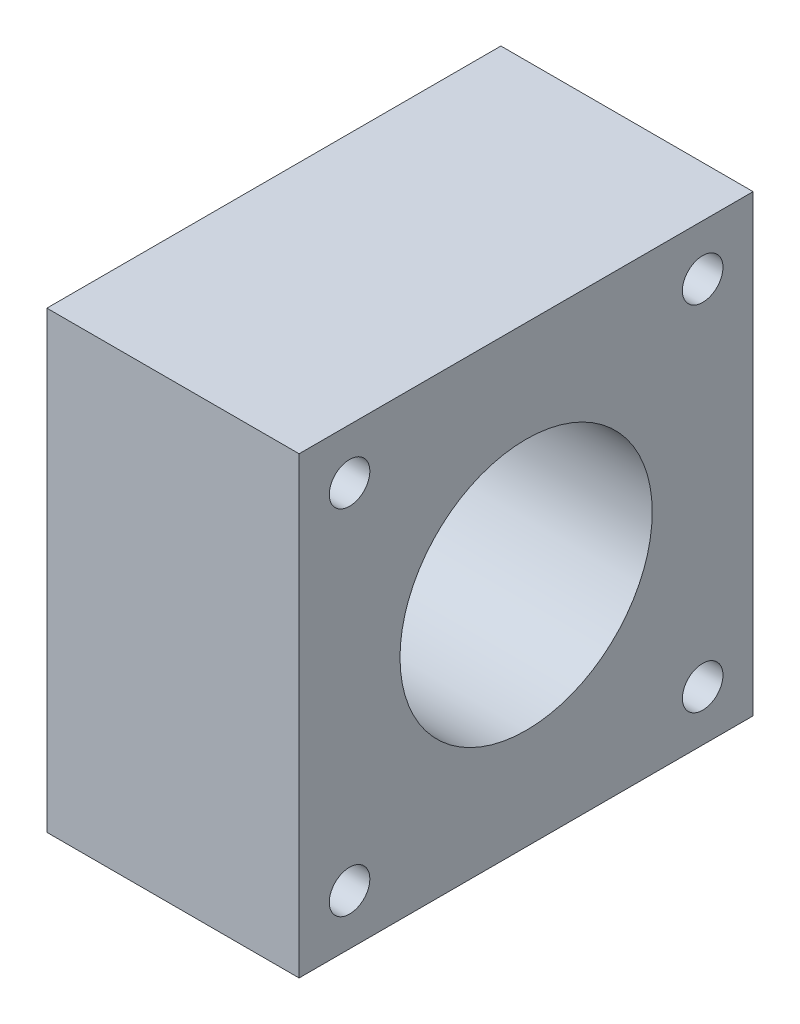
ISO-10303-21;
HEADER;
FILE_DESCRIPTION(('STEP AP214'),'2;1');
FILE_NAME('part.step','',(''),(''),'','','');
FILE_SCHEMA(('AUTOMOTIVE_DESIGN { 1 0 10303 214 1 1 1 1 }'));
ENDSEC;
DATA;
#1=APPLICATION_CONTEXT('core data for automotive mechanical design processes');
#2=APPLICATION_PROTOCOL_DEFINITION('international standard','automotive_design',2000,#1);
#3=PRODUCT_CONTEXT('',#1,'mechanical');
#4=PRODUCT('Part','Part','',(#3));
#5=PRODUCT_RELATED_PRODUCT_CATEGORY('part','',(#4));
#6=PRODUCT_DEFINITION_FORMATION('','',#4);
#7=PRODUCT_DEFINITION_CONTEXT('part definition',#1,'design');
#8=PRODUCT_DEFINITION('design','',#6,#7);
#9=PRODUCT_DEFINITION_SHAPE('','',#8);
#10=(LENGTH_UNIT() NAMED_UNIT(*) SI_UNIT(.MILLI.,.METRE.));
#11=(NAMED_UNIT(*) PLANE_ANGLE_UNIT() SI_UNIT($,.RADIAN.));
#12=(NAMED_UNIT(*) SI_UNIT($,.STERADIAN.) SOLID_ANGLE_UNIT());
#13=UNCERTAINTY_MEASURE_WITH_UNIT(LENGTH_MEASURE(1.E-05),#10,'distance_accuracy_value','');
#14=(GEOMETRIC_REPRESENTATION_CONTEXT(3) GLOBAL_UNCERTAINTY_ASSIGNED_CONTEXT((#13)) GLOBAL_UNIT_ASSIGNED_CONTEXT((#10,
#11,#12)) REPRESENTATION_CONTEXT('',''));
#15=CARTESIAN_POINT('',(0.,0.,0.));
#16=DIRECTION('',(0.,0.,1.));
#17=DIRECTION('',(1.,0.,0.));
#18=AXIS2_PLACEMENT_3D('',#15,#16,#17);
#19=CARTESIAN_POINT('',(0.,28.575,-28.575));
#20=DIRECTION('',(1.,0.,0.));
#21=DIRECTION('',(0.,0.,-1.));
#22=AXIS2_PLACEMENT_3D('',#19,#20,#21);
#23=CYLINDRICAL_SURFACE('',#22,15.875);
#24=CARTESIAN_POINT('',(31.75,28.575,-28.575));
#25=DIRECTION('',(1.,0.,0.));
#26=DIRECTION('',(0.,0.,-1.));
#27=AXIS2_PLACEMENT_3D('',#24,#25,#26);
#28=CIRCLE('',#27,15.875);
#29=CARTESIAN_POINT('',(31.75,28.575,-44.45));
#30=VERTEX_POINT('',#29);
#31=EDGE_CURVE('E160',#30,#30,#28,.T.);
#32=ORIENTED_EDGE('',*,*,#31,.T.);
#33=EDGE_LOOP('',(#32));
#34=FACE_BOUND('',#33,.T.);
#35=CARTESIAN_POINT('',(2.54,28.575,-28.575));
#36=DIRECTION('',(-1.,0.,0.));
#37=DIRECTION('',(0.,0.,1.));
#38=AXIS2_PLACEMENT_3D('',#35,#36,#37);
#39=CIRCLE('',#38,15.875);
#40=CARTESIAN_POINT('',(2.54,28.575,-12.7));
#41=VERTEX_POINT('',#40);
#42=EDGE_CURVE('E158',#41,#41,#39,.F.);
#43=ORIENTED_EDGE('',*,*,#42,.F.);
#44=EDGE_LOOP('',(#43));
#45=FACE_BOUND('',#44,.T.);
#46=ADVANCED_FACE('F37',(#34,#45),#23,.F.);
#47=CARTESIAN_POINT('',(31.75,0.,0.));
#48=DIRECTION('',(0.,0.,-1.));
#49=DIRECTION('',(-1.,0.,0.));
#50=AXIS2_PLACEMENT_3D('',#47,#48,#49);
#51=PLANE('',#50);
#52=DIRECTION('',(0.,-1.,0.));
#53=VECTOR('',#52,1.);
#54=CARTESIAN_POINT('',(0.,0.,0.));
#55=LINE('',#54,#53);
#56=CARTESIAN_POINT('',(0.,57.15,0.));
#57=VERTEX_POINT('',#56);
#58=CARTESIAN_POINT('',(0.,0.,0.));
#59=VERTEX_POINT('',#58);
#60=EDGE_CURVE('E149',#57,#59,#55,.T.);
#61=ORIENTED_EDGE('',*,*,#60,.T.);
#62=DIRECTION('',(-1.,0.,0.));
#63=VECTOR('',#62,1.);
#64=CARTESIAN_POINT('',(31.75,0.,0.));
#65=LINE('',#64,#63);
#66=CARTESIAN_POINT('',(31.75,0.,0.));
#67=VERTEX_POINT('',#66);
#68=EDGE_CURVE('E129',#67,#59,#65,.T.);
#69=ORIENTED_EDGE('',*,*,#68,.F.);
#70=DIRECTION('',(0.,-1.,0.));
#71=VECTOR('',#70,1.);
#72=CARTESIAN_POINT('',(31.75,0.,0.));
#73=LINE('',#72,#71);
#74=CARTESIAN_POINT('',(31.75,57.15,0.));
#75=VERTEX_POINT('',#74);
#76=EDGE_CURVE('E136',#75,#67,#73,.T.);
#77=ORIENTED_EDGE('',*,*,#76,.F.);
#78=DIRECTION('',(-1.,0.,0.));
#79=VECTOR('',#78,1.);
#80=CARTESIAN_POINT('',(31.75,57.15,0.));
#81=LINE('',#80,#79);
#82=EDGE_CURVE('E233',#75,#57,#81,.T.);
#83=ORIENTED_EDGE('',*,*,#82,.T.);
#84=EDGE_LOOP('',(#61,#69,#77,#83));
#85=FACE_BOUND('',#84,.T.);
#86=ADVANCED_FACE('F147',(#85),#51,.F.);
#87=CARTESIAN_POINT('',(31.75,0.,0.));
#88=DIRECTION('',(0.,1.,0.));
#89=DIRECTION('',(0.,0.,1.));
#90=AXIS2_PLACEMENT_3D('',#87,#88,#89);
#91=PLANE('',#90);
#92=DIRECTION('',(0.,0.,-1.));
#93=VECTOR('',#92,1.);
#94=CARTESIAN_POINT('',(0.,0.,0.));
#95=LINE('',#94,#93);
#96=CARTESIAN_POINT('',(0.,0.,-57.15));
#97=VERTEX_POINT('',#96);
#98=EDGE_CURVE('E235',#59,#97,#95,.T.);
#99=ORIENTED_EDGE('',*,*,#98,.T.);
#100=DIRECTION('',(-1.,0.,0.));
#101=VECTOR('',#100,1.);
#102=CARTESIAN_POINT('',(31.75,0.,-57.15));
#103=LINE('',#102,#101);
#104=CARTESIAN_POINT('',(31.75,0.,-57.15));
#105=VERTEX_POINT('',#104);
#106=EDGE_CURVE('E132',#105,#97,#103,.T.);
#107=ORIENTED_EDGE('',*,*,#106,.F.);
#108=DIRECTION('',(0.,0.,-1.));
#109=VECTOR('',#108,1.);
#110=CARTESIAN_POINT('',(31.75,0.,0.));
#111=LINE('',#110,#109);
#112=EDGE_CURVE('E125',#67,#105,#111,.T.);
#113=ORIENTED_EDGE('',*,*,#112,.F.);
#114=ORIENTED_EDGE('',*,*,#68,.T.);
#115=EDGE_LOOP('',(#99,#107,#113,#114));
#116=FACE_BOUND('',#115,.T.);
#117=ADVANCED_FACE('F127',(#116),#91,.F.);
#118=CARTESIAN_POINT('',(31.75,0.,-57.15));
#119=DIRECTION('',(0.,0.,1.));
#120=DIRECTION('',(1.,0.,0.));
#121=AXIS2_PLACEMENT_3D('',#118,#119,#120);
#122=PLANE('',#121);
#123=DIRECTION('',(0.,1.,0.));
#124=VECTOR('',#123,1.);
#125=CARTESIAN_POINT('',(0.,0.,-57.15));
#126=LINE('',#125,#124);
#127=CARTESIAN_POINT('',(0.,57.15,-57.15));
#128=VERTEX_POINT('',#127);
#129=EDGE_CURVE('E237',#97,#128,#126,.T.);
#130=ORIENTED_EDGE('',*,*,#129,.T.);
#131=DIRECTION('',(-1.,0.,0.));
#132=VECTOR('',#131,1.);
#133=CARTESIAN_POINT('',(31.75,57.15,-57.15));
#134=LINE('',#133,#132);
#135=CARTESIAN_POINT('',(31.75,57.15,-57.15));
#136=VERTEX_POINT('',#135);
#137=EDGE_CURVE('E154',#136,#128,#134,.T.);
#138=ORIENTED_EDGE('',*,*,#137,.F.);
#139=DIRECTION('',(0.,1.,0.));
#140=VECTOR('',#139,1.);
#141=CARTESIAN_POINT('',(31.75,0.,-57.15));
#142=LINE('',#141,#140);
#143=EDGE_CURVE('E135',#105,#136,#142,.T.);
#144=ORIENTED_EDGE('',*,*,#143,.F.);
#145=ORIENTED_EDGE('',*,*,#106,.T.);
#146=EDGE_LOOP('',(#130,#138,#144,#145));
#147=FACE_BOUND('',#146,.T.);
#148=ADVANCED_FACE('F247',(#147),#122,.F.);
#149=CARTESIAN_POINT('',(31.75,57.15,0.));
#150=DIRECTION('',(0.,-1.,0.));
#151=DIRECTION('',(0.,0.,-1.));
#152=AXIS2_PLACEMENT_3D('',#149,#150,#151);
#153=PLANE('',#152);
#154=DIRECTION('',(0.,0.,1.));
#155=VECTOR('',#154,1.);
#156=CARTESIAN_POINT('',(0.,57.15,0.));
#157=LINE('',#156,#155);
#158=EDGE_CURVE('E145',#128,#57,#157,.T.);
#159=ORIENTED_EDGE('',*,*,#158,.T.);
#160=ORIENTED_EDGE('',*,*,#82,.F.);
#161=DIRECTION('',(0.,0.,1.));
#162=VECTOR('',#161,1.);
#163=CARTESIAN_POINT('',(31.75,57.15,0.));
#164=LINE('',#163,#162);
#165=EDGE_CURVE('E141',#136,#75,#164,.T.);
#166=ORIENTED_EDGE('',*,*,#165,.F.);
#167=ORIENTED_EDGE('',*,*,#137,.T.);
#168=EDGE_LOOP('',(#159,#160,#166,#167));
#169=FACE_BOUND('',#168,.T.);
#170=ADVANCED_FACE('F244',(#169),#153,.F.);
#171=CARTESIAN_POINT('',(31.75,0.,0.));
#172=DIRECTION('',(-1.,0.,0.));
#173=DIRECTION('',(0.,0.,1.));
#174=AXIS2_PLACEMENT_3D('',#171,#172,#173);
#175=PLANE('',#174);
#176=CARTESIAN_POINT('',(31.75,50.8,-6.34999999999999));
#177=DIRECTION('',(1.,0.,0.));
#178=DIRECTION('',(0.,0.,-1.));
#179=AXIS2_PLACEMENT_3D('',#176,#177,#178);
#180=CIRCLE('',#179,2.55269999999999);
#181=CARTESIAN_POINT('',(31.75,50.8,-8.90269999999999));
#182=VERTEX_POINT('',#181);
#183=EDGE_CURVE('E356',#182,#182,#180,.T.);
#184=ORIENTED_EDGE('',*,*,#183,.F.);
#185=EDGE_LOOP('',(#184));
#186=FACE_BOUND('',#185,.T.);
#187=CARTESIAN_POINT('',(31.75,50.8,-50.8));
#188=DIRECTION('',(1.,0.,0.));
#189=DIRECTION('',(0.,0.,-1.));
#190=AXIS2_PLACEMENT_3D('',#187,#188,#189);
#191=CIRCLE('',#190,2.55269999999998);
#192=CARTESIAN_POINT('',(31.75,50.8,-53.3527));
#193=VERTEX_POINT('',#192);
#194=EDGE_CURVE('E358',#193,#193,#191,.T.);
#195=ORIENTED_EDGE('',*,*,#194,.F.);
#196=EDGE_LOOP('',(#195));
#197=FACE_BOUND('',#196,.T.);
#198=CARTESIAN_POINT('',(31.75,6.35000000000001,-50.8));
#199=DIRECTION('',(1.,0.,0.));
#200=DIRECTION('',(0.,0.,-1.));
#201=AXIS2_PLACEMENT_3D('',#198,#199,#200);
#202=CIRCLE('',#201,2.55269999999999);
#203=CARTESIAN_POINT('',(31.75,6.35000000000001,-53.3527));
#204=VERTEX_POINT('',#203);
#205=EDGE_CURVE('E364',#204,#204,#202,.T.);
#206=ORIENTED_EDGE('',*,*,#205,.F.);
#207=EDGE_LOOP('',(#206));
#208=FACE_BOUND('',#207,.T.);
#209=CARTESIAN_POINT('',(31.75,6.35000000000001,-6.35000000000002));
#210=DIRECTION('',(1.,0.,0.));
#211=DIRECTION('',(0.,0.,-1.));
#212=AXIS2_PLACEMENT_3D('',#209,#210,#211);
#213=CIRCLE('',#212,2.55269999999999);
#214=CARTESIAN_POINT('',(31.75,6.35000000000001,-8.90270000000001));
#215=VERTEX_POINT('',#214);
#216=EDGE_CURVE('E293',#215,#215,#213,.T.);
#217=ORIENTED_EDGE('',*,*,#216,.F.);
#218=EDGE_LOOP('',(#217));
#219=FACE_BOUND('',#218,.T.);
#220=ORIENTED_EDGE('',*,*,#31,.F.);
#221=EDGE_LOOP('',(#220));
#222=FACE_BOUND('',#221,.T.);
#223=ORIENTED_EDGE('',*,*,#76,.T.);
#224=ORIENTED_EDGE('',*,*,#112,.T.);
#225=ORIENTED_EDGE('',*,*,#143,.T.);
#226=ORIENTED_EDGE('',*,*,#165,.T.);
#227=EDGE_LOOP('',(#223,#224,#225,#226));
#228=FACE_BOUND('',#227,.T.);
#229=ADVANCED_FACE('F139',(#186,#197,#208,#219,#222,#228),#175,.F.);
#230=CARTESIAN_POINT('',(0.,0.,0.));
#231=DIRECTION('',(-1.,0.,0.));
#232=DIRECTION('',(0.,0.,1.));
#233=AXIS2_PLACEMENT_3D('',#230,#231,#232);
#234=PLANE('',#233);
#235=CARTESIAN_POINT('',(0.,50.8,-6.34999999999999));
#236=DIRECTION('',(1.,0.,0.));
#237=DIRECTION('',(0.,0.,-1.));
#238=AXIS2_PLACEMENT_3D('',#235,#236,#237);
#239=CIRCLE('',#238,2.55269999999999);
#240=CARTESIAN_POINT('',(0.,50.8,-8.90269999999999));
#241=VERTEX_POINT('',#240);
#242=EDGE_CURVE('E281',#241,#241,#239,.T.);
#243=ORIENTED_EDGE('',*,*,#242,.T.);
#244=EDGE_LOOP('',(#243));
#245=FACE_BOUND('',#244,.T.);
#246=CARTESIAN_POINT('',(0.,50.8,-50.8));
#247=DIRECTION('',(1.,0.,0.));
#248=DIRECTION('',(0.,0.,-1.));
#249=AXIS2_PLACEMENT_3D('',#246,#247,#248);
#250=CIRCLE('',#249,2.5527);
#251=CARTESIAN_POINT('',(0.,50.8,-53.3527));
#252=VERTEX_POINT('',#251);
#253=EDGE_CURVE('E285',#252,#252,#250,.T.);
#254=ORIENTED_EDGE('',*,*,#253,.T.);
#255=EDGE_LOOP('',(#254));
#256=FACE_BOUND('',#255,.T.);
#257=CARTESIAN_POINT('',(0.,6.35000000000001,-50.8));
#258=DIRECTION('',(1.,0.,0.));
#259=DIRECTION('',(0.,0.,-1.));
#260=AXIS2_PLACEMENT_3D('',#257,#258,#259);
#261=CIRCLE('',#260,2.55269999999999);
#262=CARTESIAN_POINT('',(0.,6.35000000000001,-53.3527));
#263=VERTEX_POINT('',#262);
#264=EDGE_CURVE('E289',#263,#263,#261,.T.);
#265=ORIENTED_EDGE('',*,*,#264,.T.);
#266=EDGE_LOOP('',(#265));
#267=FACE_BOUND('',#266,.T.);
#268=CARTESIAN_POINT('',(0.,6.35000000000001,-6.35000000000002));
#269=DIRECTION('',(1.,0.,0.));
#270=DIRECTION('',(0.,0.,-1.));
#271=AXIS2_PLACEMENT_3D('',#268,#269,#270);
#272=CIRCLE('',#271,2.55269999999999);
#273=CARTESIAN_POINT('',(0.,6.35000000000001,-8.90270000000001));
#274=VERTEX_POINT('',#273);
#275=EDGE_CURVE('E224',#274,#274,#272,.T.);
#276=ORIENTED_EDGE('',*,*,#275,.T.);
#277=EDGE_LOOP('',(#276));
#278=FACE_BOUND('',#277,.T.);
#279=CARTESIAN_POINT('',(0.,28.575,-28.575));
#280=DIRECTION('',(-1.,0.,0.));
#281=DIRECTION('',(0.,0.,1.));
#282=AXIS2_PLACEMENT_3D('',#279,#280,#281);
#283=CIRCLE('',#282,19.05);
#284=CARTESIAN_POINT('',(0.,45.72,-36.878702487445));
#285=VERTEX_POINT('',#284);
#286=CARTESIAN_POINT('',(0.,11.43,-36.8787024874449));
#287=VERTEX_POINT('',#286);
#288=EDGE_CURVE('E221',#285,#287,#283,.T.);
#289=ORIENTED_EDGE('',*,*,#288,.F.);
#290=CARTESIAN_POINT('',(0.,42.8625,-35.4947520728708));
#291=DIRECTION('',(-1.,0.,0.));
#292=DIRECTION('',(0.,0.,1.));
#293=AXIS2_PLACEMENT_3D('',#290,#291,#292);
#294=CIRCLE('',#293,3.175);
#295=CARTESIAN_POINT('',(0.,46.0375,-35.4947520728708));
#296=VERTEX_POINT('',#295);
#297=EDGE_CURVE('E11',#285,#296,#294,.F.);
#298=ORIENTED_EDGE('',*,*,#297,.T.);
#299=DIRECTION('',(0.,0.,-1.));
#300=VECTOR('',#299,1.);
#301=CARTESIAN_POINT('',(0.,46.0375,-36.1883825432589));
#302=LINE('',#301,#300);
#303=CARTESIAN_POINT('',(0.,46.0375,-21.6552479271292));
#304=VERTEX_POINT('',#303);
#305=EDGE_CURVE('E195',#304,#296,#302,.T.);
#306=ORIENTED_EDGE('',*,*,#305,.F.);
#307=CARTESIAN_POINT('',(0.,42.8625,-21.6552479271292));
#308=DIRECTION('',(-1.,0.,0.));
#309=DIRECTION('',(0.,0.,1.));
#310=AXIS2_PLACEMENT_3D('',#307,#308,#309);
#311=CIRCLE('',#310,3.175);
#312=CARTESIAN_POINT('',(0.,45.72,-20.2712975125551));
#313=VERTEX_POINT('',#312);
#314=EDGE_CURVE('E45',#304,#313,#311,.F.);
#315=ORIENTED_EDGE('',*,*,#314,.T.);
#316=CARTESIAN_POINT('',(0.,28.575,-28.575));
#317=DIRECTION('',(-1.,0.,0.));
#318=DIRECTION('',(0.,0.,-1.));
#319=AXIS2_PLACEMENT_3D('',#316,#317,#318);
#320=CIRCLE('',#319,19.05);
#321=CARTESIAN_POINT('',(0.,11.43,-20.2712975125551));
#322=VERTEX_POINT('',#321);
#323=EDGE_CURVE('E194',#322,#313,#320,.T.);
#324=ORIENTED_EDGE('',*,*,#323,.F.);
#325=CARTESIAN_POINT('',(0.,14.2875,-21.6552479271292));
#326=DIRECTION('',(-1.,0.,0.));
#327=DIRECTION('',(0.,0.,1.));
#328=AXIS2_PLACEMENT_3D('',#325,#326,#327);
#329=CIRCLE('',#328,3.175);
#330=CARTESIAN_POINT('',(0.,11.1125,-21.6552479271292));
#331=VERTEX_POINT('',#330);
#332=EDGE_CURVE('E189',#322,#331,#329,.F.);
#333=ORIENTED_EDGE('',*,*,#332,.T.);
#334=DIRECTION('',(0.,0.,1.));
#335=VECTOR('',#334,1.);
#336=CARTESIAN_POINT('',(0.,11.1125,-20.9616174567411));
#337=LINE('',#336,#335);
#338=CARTESIAN_POINT('',(0.,11.1125,-35.4947520728708));
#339=VERTEX_POINT('',#338);
#340=EDGE_CURVE('E201',#339,#331,#337,.T.);
#341=ORIENTED_EDGE('',*,*,#340,.F.);
#342=CARTESIAN_POINT('',(0.,14.2875,-35.4947520728708));
#343=DIRECTION('',(-1.,0.,0.));
#344=DIRECTION('',(0.,0.,1.));
#345=AXIS2_PLACEMENT_3D('',#342,#343,#344);
#346=CIRCLE('',#345,3.175);
#347=EDGE_CURVE('E187',#339,#287,#346,.F.);
#348=ORIENTED_EDGE('',*,*,#347,.T.);
#349=EDGE_LOOP('',(#289,#298,#306,#315,#324,#333,#341,#348));
#350=FACE_BOUND('',#349,.T.);
#351=ORIENTED_EDGE('',*,*,#60,.F.);
#352=ORIENTED_EDGE('',*,*,#158,.F.);
#353=ORIENTED_EDGE('',*,*,#129,.F.);
#354=ORIENTED_EDGE('',*,*,#98,.F.);
#355=EDGE_LOOP('',(#351,#352,#353,#354));
#356=FACE_BOUND('',#355,.T.);
#357=ADVANCED_FACE('F192',(#245,#256,#267,#278,#350,#356),#234,.T.);
#358=CARTESIAN_POINT('',(2.54,28.575,-28.575));
#359=DIRECTION('',(-1.,0.,0.));
#360=DIRECTION('',(0.,0.,1.));
#361=AXIS2_PLACEMENT_3D('',#358,#359,#360);
#362=PLANE('',#361);
#363=CARTESIAN_POINT('',(2.54,28.575,-28.575));
#364=DIRECTION('',(-1.,0.,0.));
#365=DIRECTION('',(0.,0.,1.));
#366=AXIS2_PLACEMENT_3D('',#363,#364,#365);
#367=CIRCLE('',#366,19.05);
#368=CARTESIAN_POINT('',(2.54,45.72,-36.878702487445));
#369=VERTEX_POINT('',#368);
#370=CARTESIAN_POINT('',(2.54,11.43,-36.8787024874449));
#371=VERTEX_POINT('',#370);
#372=EDGE_CURVE('E228',#369,#371,#367,.T.);
#373=ORIENTED_EDGE('',*,*,#372,.T.);
#374=CARTESIAN_POINT('',(2.54,14.2875,-35.4947520728708));
#375=DIRECTION('',(-1.,0.,0.));
#376=DIRECTION('',(0.,0.,1.));
#377=AXIS2_PLACEMENT_3D('',#374,#375,#376);
#378=CIRCLE('',#377,3.175);
#379=CARTESIAN_POINT('',(2.54,11.1125,-35.4947520728708));
#380=VERTEX_POINT('',#379);
#381=EDGE_CURVE('E176',#371,#380,#378,.T.);
#382=ORIENTED_EDGE('',*,*,#381,.T.);
#383=DIRECTION('',(0.,0.,1.));
#384=VECTOR('',#383,1.);
#385=CARTESIAN_POINT('',(2.54,11.1125,-20.9616174567411));
#386=LINE('',#385,#384);
#387=CARTESIAN_POINT('',(2.54,11.1125,-21.6552479271292));
#388=VERTEX_POINT('',#387);
#389=EDGE_CURVE('E217',#380,#388,#386,.T.);
#390=ORIENTED_EDGE('',*,*,#389,.T.);
#391=CARTESIAN_POINT('',(2.54,14.2875,-21.6552479271292));
#392=DIRECTION('',(-1.,0.,0.));
#393=DIRECTION('',(0.,0.,1.));
#394=AXIS2_PLACEMENT_3D('',#391,#392,#393);
#395=CIRCLE('',#394,3.175);
#396=CARTESIAN_POINT('',(2.54,11.43,-20.2712975125551));
#397=VERTEX_POINT('',#396);
#398=EDGE_CURVE('E174',#388,#397,#395,.T.);
#399=ORIENTED_EDGE('',*,*,#398,.T.);
#400=CARTESIAN_POINT('',(2.54,28.575,-28.575));
#401=DIRECTION('',(-1.,0.,0.));
#402=DIRECTION('',(0.,0.,-1.));
#403=AXIS2_PLACEMENT_3D('',#400,#401,#402);
#404=CIRCLE('',#403,19.05);
#405=CARTESIAN_POINT('',(2.54,45.72,-20.2712975125551));
#406=VERTEX_POINT('',#405);
#407=EDGE_CURVE('E212',#397,#406,#404,.T.);
#408=ORIENTED_EDGE('',*,*,#407,.T.);
#409=CARTESIAN_POINT('',(2.54,42.8625,-21.6552479271292));
#410=DIRECTION('',(-1.,0.,0.));
#411=DIRECTION('',(0.,0.,1.));
#412=AXIS2_PLACEMENT_3D('',#409,#410,#411);
#413=CIRCLE('',#412,3.175);
#414=CARTESIAN_POINT('',(2.54,46.0375,-21.6552479271292));
#415=VERTEX_POINT('',#414);
#416=EDGE_CURVE('E172',#406,#415,#413,.T.);
#417=ORIENTED_EDGE('',*,*,#416,.T.);
#418=DIRECTION('',(0.,0.,-1.));
#419=VECTOR('',#418,1.);
#420=CARTESIAN_POINT('',(2.54,46.0375,-36.1883825432589));
#421=LINE('',#420,#419);
#422=CARTESIAN_POINT('',(2.54,46.0375,-35.4947520728708));
#423=VERTEX_POINT('',#422);
#424=EDGE_CURVE('E161',#415,#423,#421,.T.);
#425=ORIENTED_EDGE('',*,*,#424,.T.);
#426=CARTESIAN_POINT('',(2.54,42.8625,-35.4947520728708));
#427=DIRECTION('',(-1.,0.,0.));
#428=DIRECTION('',(0.,0.,1.));
#429=AXIS2_PLACEMENT_3D('',#426,#427,#428);
#430=CIRCLE('',#429,3.175);
#431=EDGE_CURVE('E170',#423,#369,#430,.T.);
#432=ORIENTED_EDGE('',*,*,#431,.T.);
#433=EDGE_LOOP('',(#373,#382,#390,#399,#408,#417,#425,#432));
#434=FACE_BOUND('',#433,.T.);
#435=ORIENTED_EDGE('',*,*,#42,.T.);
#436=EDGE_LOOP('',(#435));
#437=FACE_BOUND('',#436,.T.);
#438=ADVANCED_FACE('F209',(#434,#437),#362,.T.);
#439=CARTESIAN_POINT('',(2.54,28.575,-28.575));
#440=DIRECTION('',(-1.,0.,0.));
#441=DIRECTION('',(0.,0.,1.));
#442=AXIS2_PLACEMENT_3D('',#439,#440,#441);
#443=CYLINDRICAL_SURFACE('',#442,19.05);
#444=ORIENTED_EDGE('',*,*,#288,.T.);
#445=DIRECTION('',(-1.,0.,0.));
#446=VECTOR('',#445,1.);
#447=CARTESIAN_POINT('',(2.54,11.43,-36.8787024874449));
#448=LINE('',#447,#446);
#449=EDGE_CURVE('E168',#287,#371,#448,.F.);
#450=ORIENTED_EDGE('',*,*,#449,.T.);
#451=ORIENTED_EDGE('',*,*,#372,.F.);
#452=DIRECTION('',(-1.,0.,0.));
#453=VECTOR('',#452,1.);
#454=CARTESIAN_POINT('',(2.54,45.72,-36.878702487445));
#455=LINE('',#454,#453);
#456=EDGE_CURVE('E165',#369,#285,#455,.T.);
#457=ORIENTED_EDGE('',*,*,#456,.T.);
#458=EDGE_LOOP('',(#444,#450,#451,#457));
#459=FACE_BOUND('',#458,.T.);
#460=ADVANCED_FACE('F268',(#459),#443,.F.);
#461=CARTESIAN_POINT('',(2.54,46.0375,-36.1883825432589));
#462=DIRECTION('',(0.,1.,0.));
#463=DIRECTION('',(0.,0.,1.));
#464=AXIS2_PLACEMENT_3D('',#461,#462,#463);
#465=PLANE('',#464);
#466=ORIENTED_EDGE('',*,*,#424,.F.);
#467=DIRECTION('',(1.,0.,0.));
#468=VECTOR('',#467,1.);
#469=CARTESIAN_POINT('',(0.,46.0375,-21.6552479271292));
#470=LINE('',#469,#468);
#471=EDGE_CURVE('E185',#415,#304,#470,.F.);
#472=ORIENTED_EDGE('',*,*,#471,.T.);
#473=ORIENTED_EDGE('',*,*,#305,.T.);
#474=DIRECTION('',(1.,0.,0.));
#475=VECTOR('',#474,1.);
#476=CARTESIAN_POINT('',(2.54,46.0375,-35.4947520728708));
#477=LINE('',#476,#475);
#478=EDGE_CURVE('E183',#296,#423,#477,.T.);
#479=ORIENTED_EDGE('',*,*,#478,.T.);
#480=EDGE_LOOP('',(#466,#472,#473,#479));
#481=FACE_BOUND('',#480,.T.);
#482=ADVANCED_FACE('F214',(#481),#465,.F.);
#483=CARTESIAN_POINT('',(2.54,28.575,-28.575));
#484=DIRECTION('',(-1.,0.,0.));
#485=DIRECTION('',(0.,0.,1.));
#486=AXIS2_PLACEMENT_3D('',#483,#484,#485);
#487=CYLINDRICAL_SURFACE('',#486,19.05);
#488=ORIENTED_EDGE('',*,*,#407,.F.);
#489=DIRECTION('',(-1.,0.,0.));
#490=VECTOR('',#489,1.);
#491=CARTESIAN_POINT('',(2.54,11.43,-20.2712975125551));
#492=LINE('',#491,#490);
#493=EDGE_CURVE('E180',#397,#322,#492,.T.);
#494=ORIENTED_EDGE('',*,*,#493,.T.);
#495=ORIENTED_EDGE('',*,*,#323,.T.);
#496=DIRECTION('',(-1.,0.,0.));
#497=VECTOR('',#496,1.);
#498=CARTESIAN_POINT('',(2.54,45.72,-20.2712975125551));
#499=LINE('',#498,#497);
#500=EDGE_CURVE('E178',#313,#406,#499,.F.);
#501=ORIENTED_EDGE('',*,*,#500,.T.);
#502=EDGE_LOOP('',(#488,#494,#495,#501));
#503=FACE_BOUND('',#502,.T.);
#504=ADVANCED_FACE('F198',(#503),#487,.F.);
#505=CARTESIAN_POINT('',(2.54,11.1125,-20.9616174567411));
#506=DIRECTION('',(0.,-1.,0.));
#507=DIRECTION('',(0.,0.,-1.));
#508=AXIS2_PLACEMENT_3D('',#505,#506,#507);
#509=PLANE('',#508);
#510=ORIENTED_EDGE('',*,*,#389,.F.);
#511=DIRECTION('',(1.,0.,0.));
#512=VECTOR('',#511,1.);
#513=CARTESIAN_POINT('',(0.,11.1125,-35.4947520728708));
#514=LINE('',#513,#512);
#515=EDGE_CURVE('E152',#380,#339,#514,.F.);
#516=ORIENTED_EDGE('',*,*,#515,.T.);
#517=ORIENTED_EDGE('',*,*,#340,.T.);
#518=DIRECTION('',(1.,0.,0.));
#519=VECTOR('',#518,1.);
#520=CARTESIAN_POINT('',(2.54,11.1125,-21.6552479271292));
#521=LINE('',#520,#519);
#522=EDGE_CURVE('E150',#331,#388,#521,.T.);
#523=ORIENTED_EDGE('',*,*,#522,.T.);
#524=EDGE_LOOP('',(#510,#516,#517,#523));
#525=FACE_BOUND('',#524,.T.);
#526=ADVANCED_FACE('F309',(#525),#509,.F.);
#527=CARTESIAN_POINT('',(2.54,14.2875,-35.4947520728708));
#528=DIRECTION('',(-1.,0.,0.));
#529=DIRECTION('',(0.,0.,1.));
#530=AXIS2_PLACEMENT_3D('',#527,#528,#529);
#531=CYLINDRICAL_SURFACE('',#530,3.175);
#532=ORIENTED_EDGE('',*,*,#381,.F.);
#533=ORIENTED_EDGE('',*,*,#449,.F.);
#534=ORIENTED_EDGE('',*,*,#347,.F.);
#535=ORIENTED_EDGE('',*,*,#515,.F.);
#536=EDGE_LOOP('',(#532,#533,#534,#535));
#537=FACE_BOUND('',#536,.T.);
#538=ADVANCED_FACE('F311',(#537),#531,.F.);
#539=CARTESIAN_POINT('',(2.54,14.2875,-21.6552479271292));
#540=DIRECTION('',(-1.,0.,0.));
#541=DIRECTION('',(0.,0.,1.));
#542=AXIS2_PLACEMENT_3D('',#539,#540,#541);
#543=CYLINDRICAL_SURFACE('',#542,3.175);
#544=ORIENTED_EDGE('',*,*,#398,.F.);
#545=ORIENTED_EDGE('',*,*,#522,.F.);
#546=ORIENTED_EDGE('',*,*,#332,.F.);
#547=ORIENTED_EDGE('',*,*,#493,.F.);
#548=EDGE_LOOP('',(#544,#545,#546,#547));
#549=FACE_BOUND('',#548,.T.);
#550=ADVANCED_FACE('F307',(#549),#543,.F.);
#551=CARTESIAN_POINT('',(2.54,42.8625,-21.6552479271292));
#552=DIRECTION('',(-1.,0.,0.));
#553=DIRECTION('',(0.,0.,1.));
#554=AXIS2_PLACEMENT_3D('',#551,#552,#553);
#555=CYLINDRICAL_SURFACE('',#554,3.175);
#556=ORIENTED_EDGE('',*,*,#416,.F.);
#557=ORIENTED_EDGE('',*,*,#500,.F.);
#558=ORIENTED_EDGE('',*,*,#314,.F.);
#559=ORIENTED_EDGE('',*,*,#471,.F.);
#560=EDGE_LOOP('',(#556,#557,#558,#559));
#561=FACE_BOUND('',#560,.T.);
#562=ADVANCED_FACE('F204',(#561),#555,.F.);
#563=CARTESIAN_POINT('',(2.54,42.8625,-35.4947520728708));
#564=DIRECTION('',(-1.,0.,0.));
#565=DIRECTION('',(0.,0.,1.));
#566=AXIS2_PLACEMENT_3D('',#563,#564,#565);
#567=CYLINDRICAL_SURFACE('',#566,3.175);
#568=ORIENTED_EDGE('',*,*,#431,.F.);
#569=ORIENTED_EDGE('',*,*,#478,.F.);
#570=ORIENTED_EDGE('',*,*,#297,.F.);
#571=ORIENTED_EDGE('',*,*,#456,.F.);
#572=EDGE_LOOP('',(#568,#569,#570,#571));
#573=FACE_BOUND('',#572,.T.);
#574=ADVANCED_FACE('F39',(#573),#567,.F.);
#575=CARTESIAN_POINT('',(31.75,6.35000000000001,-6.35000000000002));
#576=DIRECTION('',(1.,0.,0.));
#577=DIRECTION('',(0.,0.,-1.));
#578=AXIS2_PLACEMENT_3D('',#575,#576,#577);
#579=CYLINDRICAL_SURFACE('',#578,2.55269999999999);
#580=ORIENTED_EDGE('',*,*,#275,.F.);
#581=EDGE_LOOP('',(#580));
#582=FACE_BOUND('',#581,.T.);
#583=ORIENTED_EDGE('',*,*,#216,.T.);
#584=EDGE_LOOP('',(#583));
#585=FACE_BOUND('',#584,.T.);
#586=ADVANCED_FACE('F318',(#582,#585),#579,.F.);
#587=CARTESIAN_POINT('',(31.75,6.35000000000001,-50.8));
#588=DIRECTION('',(1.,0.,0.));
#589=DIRECTION('',(0.,0.,-1.));
#590=AXIS2_PLACEMENT_3D('',#587,#588,#589);
#591=CYLINDRICAL_SURFACE('',#590,2.55269999999999);
#592=ORIENTED_EDGE('',*,*,#264,.F.);
#593=EDGE_LOOP('',(#592));
#594=FACE_BOUND('',#593,.T.);
#595=ORIENTED_EDGE('',*,*,#205,.T.);
#596=EDGE_LOOP('',(#595));
#597=FACE_BOUND('',#596,.T.);
#598=ADVANCED_FACE('F323',(#594,#597),#591,.F.);
#599=CARTESIAN_POINT('',(31.75,50.8,-50.8));
#600=DIRECTION('',(1.,0.,0.));
#601=DIRECTION('',(0.,0.,-1.));
#602=AXIS2_PLACEMENT_3D('',#599,#600,#601);
#603=CYLINDRICAL_SURFACE('',#602,2.55269999999999);
#604=ORIENTED_EDGE('',*,*,#253,.F.);
#605=EDGE_LOOP('',(#604));
#606=FACE_BOUND('',#605,.T.);
#607=ORIENTED_EDGE('',*,*,#194,.T.);
#608=EDGE_LOOP('',(#607));
#609=FACE_BOUND('',#608,.T.);
#610=ADVANCED_FACE('F343',(#606,#609),#603,.F.);
#611=CARTESIAN_POINT('',(31.75,50.8,-6.34999999999999));
#612=DIRECTION('',(1.,0.,0.));
#613=DIRECTION('',(0.,0.,-1.));
#614=AXIS2_PLACEMENT_3D('',#611,#612,#613);
#615=CYLINDRICAL_SURFACE('',#614,2.55269999999999);
#616=ORIENTED_EDGE('',*,*,#242,.F.);
#617=EDGE_LOOP('',(#616));
#618=FACE_BOUND('',#617,.T.);
#619=ORIENTED_EDGE('',*,*,#183,.T.);
#620=EDGE_LOOP('',(#619));
#621=FACE_BOUND('',#620,.T.);
#622=ADVANCED_FACE('F347',(#618,#621),#615,.F.);
#623=CLOSED_SHELL('',(#46,#86,#117,#148,#170,#229,#357,#438,#460,#482,#504,#526,#538,#550,#562,
#574,#586,#598,#610,#622));
#624=MANIFOLD_SOLID_BREP('B2',#623);
#625=ADVANCED_BREP_SHAPE_REPRESENTATION('',(#18,#624),#14);
#626=SHAPE_DEFINITION_REPRESENTATION(#9,#625);
ENDSEC;
END-ISO-10303-21;
